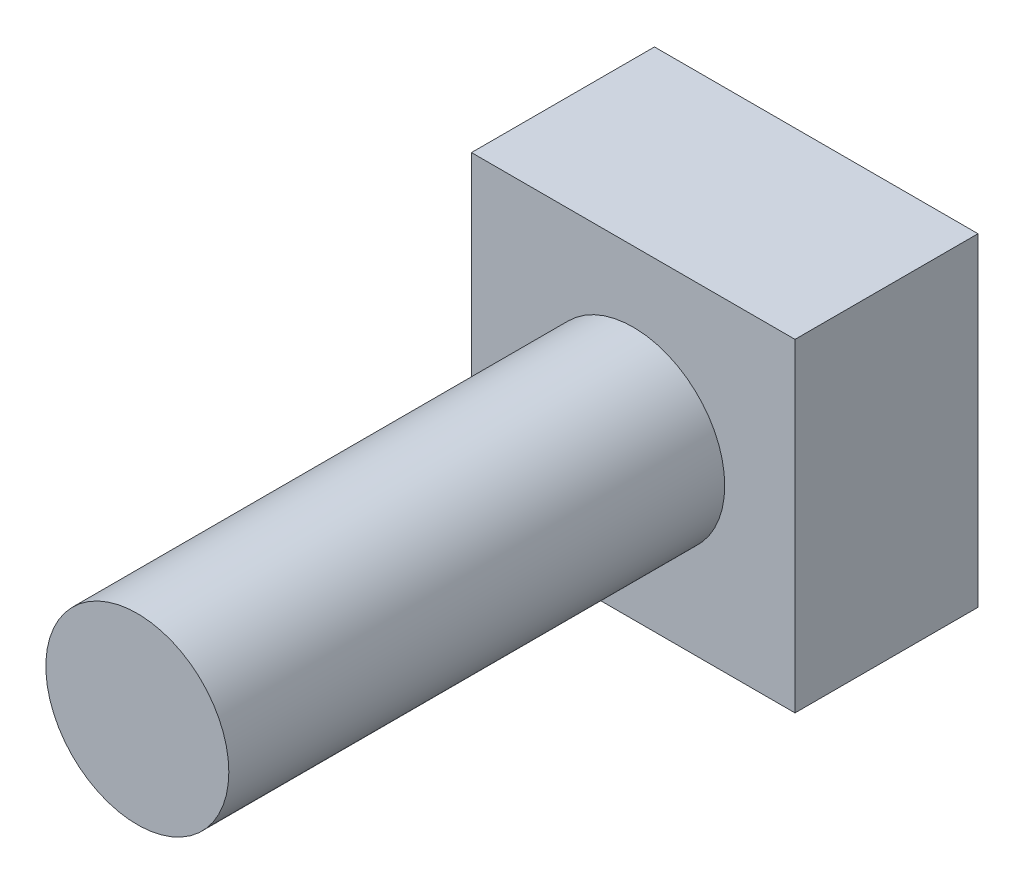
ISO-10303-21;
HEADER;
FILE_DESCRIPTION(('STEP AP214'),'2;1');
FILE_NAME('part.step','',(''),(''),'','','');
FILE_SCHEMA(('AUTOMOTIVE_DESIGN { 1 0 10303 214 1 1 1 1 }'));
ENDSEC;
DATA;
#1=APPLICATION_CONTEXT('core data for automotive mechanical design processes');
#2=APPLICATION_PROTOCOL_DEFINITION('international standard','automotive_design',2000,#1);
#3=PRODUCT_CONTEXT('',#1,'mechanical');
#4=PRODUCT('Part','Part','',(#3));
#5=PRODUCT_RELATED_PRODUCT_CATEGORY('part','',(#4));
#6=PRODUCT_DEFINITION_FORMATION('','',#4);
#7=PRODUCT_DEFINITION_CONTEXT('part definition',#1,'design');
#8=PRODUCT_DEFINITION('design','',#6,#7);
#9=PRODUCT_DEFINITION_SHAPE('','',#8);
#10=(LENGTH_UNIT() NAMED_UNIT(*) SI_UNIT(.MILLI.,.METRE.));
#11=(NAMED_UNIT(*) PLANE_ANGLE_UNIT() SI_UNIT($,.RADIAN.));
#12=(NAMED_UNIT(*) SI_UNIT($,.STERADIAN.) SOLID_ANGLE_UNIT());
#13=UNCERTAINTY_MEASURE_WITH_UNIT(LENGTH_MEASURE(1.E-05),#10,'distance_accuracy_value','');
#14=(GEOMETRIC_REPRESENTATION_CONTEXT(3) GLOBAL_UNCERTAINTY_ASSIGNED_CONTEXT((#13)) GLOBAL_UNIT_ASSIGNED_CONTEXT((#10,
#11,#12)) REPRESENTATION_CONTEXT('',''));
#15=CARTESIAN_POINT('',(0.,0.,0.));
#16=DIRECTION('',(0.,0.,1.));
#17=DIRECTION('',(1.,0.,0.));
#18=AXIS2_PLACEMENT_3D('',#15,#16,#17);
#19=CARTESIAN_POINT('',(0.,0.,0.));
#20=DIRECTION('',(0.,0.,1.));
#21=DIRECTION('',(1.,0.,0.));
#22=AXIS2_PLACEMENT_3D('',#19,#20,#21);
#23=PLANE('',#22);
#24=DIRECTION('',(0.,-1.,0.));
#25=VECTOR('',#24,1.);
#26=CARTESIAN_POINT('',(-3.0988,-3.0988,0.));
#27=LINE('',#26,#25);
#28=CARTESIAN_POINT('',(-3.0988,3.0988,0.));
#29=VERTEX_POINT('',#28);
#30=CARTESIAN_POINT('',(-3.0988,-3.0988,0.));
#31=VERTEX_POINT('',#30);
#32=EDGE_CURVE('E101',#29,#31,#27,.T.);
#33=ORIENTED_EDGE('',*,*,#32,.T.);
#34=DIRECTION('',(1.,0.,0.));
#35=VECTOR('',#34,1.);
#36=CARTESIAN_POINT('',(3.0988,-3.0988,0.));
#37=LINE('',#36,#35);
#38=CARTESIAN_POINT('',(3.0988,-3.0988,0.));
#39=VERTEX_POINT('',#38);
#40=EDGE_CURVE('E104',#31,#39,#37,.T.);
#41=ORIENTED_EDGE('',*,*,#40,.T.);
#42=DIRECTION('',(0.,1.,0.));
#43=VECTOR('',#42,1.);
#44=CARTESIAN_POINT('',(3.0988,-3.0988,0.));
#45=LINE('',#44,#43);
#46=CARTESIAN_POINT('',(3.0988,3.0988,0.));
#47=VERTEX_POINT('',#46);
#48=EDGE_CURVE('E86',#39,#47,#45,.T.);
#49=ORIENTED_EDGE('',*,*,#48,.T.);
#50=DIRECTION('',(-1.,0.,0.));
#51=VECTOR('',#50,1.);
#52=CARTESIAN_POINT('',(3.0988,3.0988,0.));
#53=LINE('',#52,#51);
#54=EDGE_CURVE('E96',#47,#29,#53,.T.);
#55=ORIENTED_EDGE('',*,*,#54,.T.);
#56=EDGE_LOOP('',(#33,#41,#49,#55));
#57=FACE_BOUND('',#56,.T.);
#58=CARTESIAN_POINT('',(0.,0.,0.));
#59=DIRECTION('',(0.,0.,1.));
#60=DIRECTION('',(1.,0.,0.));
#61=AXIS2_PLACEMENT_3D('',#58,#59,#60);
#62=CIRCLE('',#61,1.7526);
#63=CARTESIAN_POINT('',(1.7526,0.,0.));
#64=VERTEX_POINT('',#63);
#65=EDGE_CURVE('E138',#64,#64,#62,.T.);
#66=ORIENTED_EDGE('',*,*,#65,.F.);
#67=EDGE_LOOP('',(#66));
#68=FACE_BOUND('',#67,.T.);
#69=ADVANCED_FACE('F35',(#57,#68),#23,.T.);
#70=CARTESIAN_POINT('',(-3.0988,-3.0988,-3.5052));
#71=DIRECTION('',(-1.,0.,0.));
#72=DIRECTION('',(0.,0.,1.));
#73=AXIS2_PLACEMENT_3D('',#70,#71,#72);
#74=PLANE('',#73);
#75=ORIENTED_EDGE('',*,*,#32,.F.);
#76=DIRECTION('',(0.,0.,1.));
#77=VECTOR('',#76,1.);
#78=CARTESIAN_POINT('',(-3.0988,3.0988,-3.5052));
#79=LINE('',#78,#77);
#80=CARTESIAN_POINT('',(-3.0988,3.0988,-3.5052));
#81=VERTEX_POINT('',#80);
#82=EDGE_CURVE('E11',#81,#29,#79,.T.);
#83=ORIENTED_EDGE('',*,*,#82,.F.);
#84=DIRECTION('',(0.,-1.,0.));
#85=VECTOR('',#84,1.);
#86=CARTESIAN_POINT('',(-3.0988,-3.0988,-3.5052));
#87=LINE('',#86,#85);
#88=CARTESIAN_POINT('',(-3.0988,-3.0988,-3.5052));
#89=VERTEX_POINT('',#88);
#90=EDGE_CURVE('E94',#81,#89,#87,.T.);
#91=ORIENTED_EDGE('',*,*,#90,.T.);
#92=DIRECTION('',(0.,0.,1.));
#93=VECTOR('',#92,1.);
#94=CARTESIAN_POINT('',(-3.0988,-3.0988,-3.5052));
#95=LINE('',#94,#93);
#96=EDGE_CURVE('E39',#89,#31,#95,.T.);
#97=ORIENTED_EDGE('',*,*,#96,.T.);
#98=EDGE_LOOP('',(#75,#83,#91,#97));
#99=FACE_BOUND('',#98,.T.);
#100=ADVANCED_FACE('F37',(#99),#74,.T.);
#101=CARTESIAN_POINT('',(3.0988,3.0988,-3.5052));
#102=DIRECTION('',(0.,1.,0.));
#103=DIRECTION('',(-1.,0.,0.));
#104=AXIS2_PLACEMENT_3D('',#101,#102,#103);
#105=PLANE('',#104);
#106=ORIENTED_EDGE('',*,*,#54,.F.);
#107=DIRECTION('',(0.,0.,1.));
#108=VECTOR('',#107,1.);
#109=CARTESIAN_POINT('',(3.0988,3.0988,-3.5052));
#110=LINE('',#109,#108);
#111=CARTESIAN_POINT('',(3.0988,3.0988,-3.5052));
#112=VERTEX_POINT('',#111);
#113=EDGE_CURVE('E45',#112,#47,#110,.T.);
#114=ORIENTED_EDGE('',*,*,#113,.F.);
#115=DIRECTION('',(-1.,0.,0.));
#116=VECTOR('',#115,1.);
#117=CARTESIAN_POINT('',(3.0988,3.0988,-3.5052));
#118=LINE('',#117,#116);
#119=EDGE_CURVE('E91',#112,#81,#118,.T.);
#120=ORIENTED_EDGE('',*,*,#119,.T.);
#121=ORIENTED_EDGE('',*,*,#82,.T.);
#122=EDGE_LOOP('',(#106,#114,#120,#121));
#123=FACE_BOUND('',#122,.T.);
#124=ADVANCED_FACE('F112',(#123),#105,.T.);
#125=CARTESIAN_POINT('',(3.0988,-3.0988,-3.5052));
#126=DIRECTION('',(1.,0.,0.));
#127=DIRECTION('',(0.,0.,-1.));
#128=AXIS2_PLACEMENT_3D('',#125,#126,#127);
#129=PLANE('',#128);
#130=ORIENTED_EDGE('',*,*,#48,.F.);
#131=DIRECTION('',(0.,0.,1.));
#132=VECTOR('',#131,1.);
#133=CARTESIAN_POINT('',(3.0988,-3.0988,-3.5052));
#134=LINE('',#133,#132);
#135=CARTESIAN_POINT('',(3.0988,-3.0988,-3.5052));
#136=VERTEX_POINT('',#135);
#137=EDGE_CURVE('E81',#136,#39,#134,.T.);
#138=ORIENTED_EDGE('',*,*,#137,.F.);
#139=DIRECTION('',(0.,1.,0.));
#140=VECTOR('',#139,1.);
#141=CARTESIAN_POINT('',(3.0988,-3.0988,-3.5052));
#142=LINE('',#141,#140);
#143=EDGE_CURVE('E84',#136,#112,#142,.T.);
#144=ORIENTED_EDGE('',*,*,#143,.T.);
#145=ORIENTED_EDGE('',*,*,#113,.T.);
#146=EDGE_LOOP('',(#130,#138,#144,#145));
#147=FACE_BOUND('',#146,.T.);
#148=ADVANCED_FACE('F83',(#147),#129,.T.);
#149=CARTESIAN_POINT('',(3.0988,-3.0988,-3.5052));
#150=DIRECTION('',(0.,-1.,0.));
#151=DIRECTION('',(1.,0.,0.));
#152=AXIS2_PLACEMENT_3D('',#149,#150,#151);
#153=PLANE('',#152);
#154=ORIENTED_EDGE('',*,*,#40,.F.);
#155=ORIENTED_EDGE('',*,*,#96,.F.);
#156=DIRECTION('',(1.,0.,0.));
#157=VECTOR('',#156,1.);
#158=CARTESIAN_POINT('',(3.0988,-3.0988,-3.5052));
#159=LINE('',#158,#157);
#160=EDGE_CURVE('E90',#89,#136,#159,.T.);
#161=ORIENTED_EDGE('',*,*,#160,.T.);
#162=ORIENTED_EDGE('',*,*,#137,.T.);
#163=EDGE_LOOP('',(#154,#155,#161,#162));
#164=FACE_BOUND('',#163,.T.);
#165=ADVANCED_FACE('F93',(#164),#153,.T.);
#166=CARTESIAN_POINT('',(0.,0.,-3.5052));
#167=DIRECTION('',(0.,0.,1.));
#168=DIRECTION('',(1.,0.,0.));
#169=AXIS2_PLACEMENT_3D('',#166,#167,#168);
#170=PLANE('',#169);
#171=ORIENTED_EDGE('',*,*,#90,.F.);
#172=ORIENTED_EDGE('',*,*,#119,.F.);
#173=ORIENTED_EDGE('',*,*,#143,.F.);
#174=ORIENTED_EDGE('',*,*,#160,.F.);
#175=EDGE_LOOP('',(#171,#172,#173,#174));
#176=FACE_BOUND('',#175,.T.);
#177=ADVANCED_FACE('F89',(#176),#170,.F.);
#178=CARTESIAN_POINT('',(0.,0.,9.4996));
#179=DIRECTION('',(0.,0.,-1.));
#180=DIRECTION('',(-1.,0.,0.));
#181=AXIS2_PLACEMENT_3D('',#178,#179,#180);
#182=CYLINDRICAL_SURFACE('',#181,1.7526);
#183=CARTESIAN_POINT('',(0.,0.,9.4996));
#184=DIRECTION('',(0.,0.,1.));
#185=DIRECTION('',(1.,0.,0.));
#186=AXIS2_PLACEMENT_3D('',#183,#184,#185);
#187=CIRCLE('',#186,1.7526);
#188=CARTESIAN_POINT('',(1.7526,0.,9.4996));
#189=VERTEX_POINT('',#188);
#190=EDGE_CURVE('E105',#189,#189,#187,.T.);
#191=ORIENTED_EDGE('',*,*,#190,.F.);
#192=EDGE_LOOP('',(#191));
#193=FACE_BOUND('',#192,.T.);
#194=ORIENTED_EDGE('',*,*,#65,.T.);
#195=EDGE_LOOP('',(#194));
#196=FACE_BOUND('',#195,.T.);
#197=ADVANCED_FACE('F127',(#193,#196),#182,.T.);
#198=CARTESIAN_POINT('',(0.,0.,9.4996));
#199=DIRECTION('',(0.,0.,1.));
#200=DIRECTION('',(1.,0.,0.));
#201=AXIS2_PLACEMENT_3D('',#198,#199,#200);
#202=PLANE('',#201);
#203=ORIENTED_EDGE('',*,*,#190,.T.);
#204=EDGE_LOOP('',(#203));
#205=FACE_BOUND('',#204,.T.);
#206=ADVANCED_FACE('F130',(#205),#202,.T.);
#207=CLOSED_SHELL('',(#69,#100,#124,#148,#165,#177,#197,#206));
#208=MANIFOLD_SOLID_BREP('B2',#207);
#209=ADVANCED_BREP_SHAPE_REPRESENTATION('',(#18,#208),#14);
#210=SHAPE_DEFINITION_REPRESENTATION(#9,#209);
ENDSEC;
END-ISO-10303-21;
